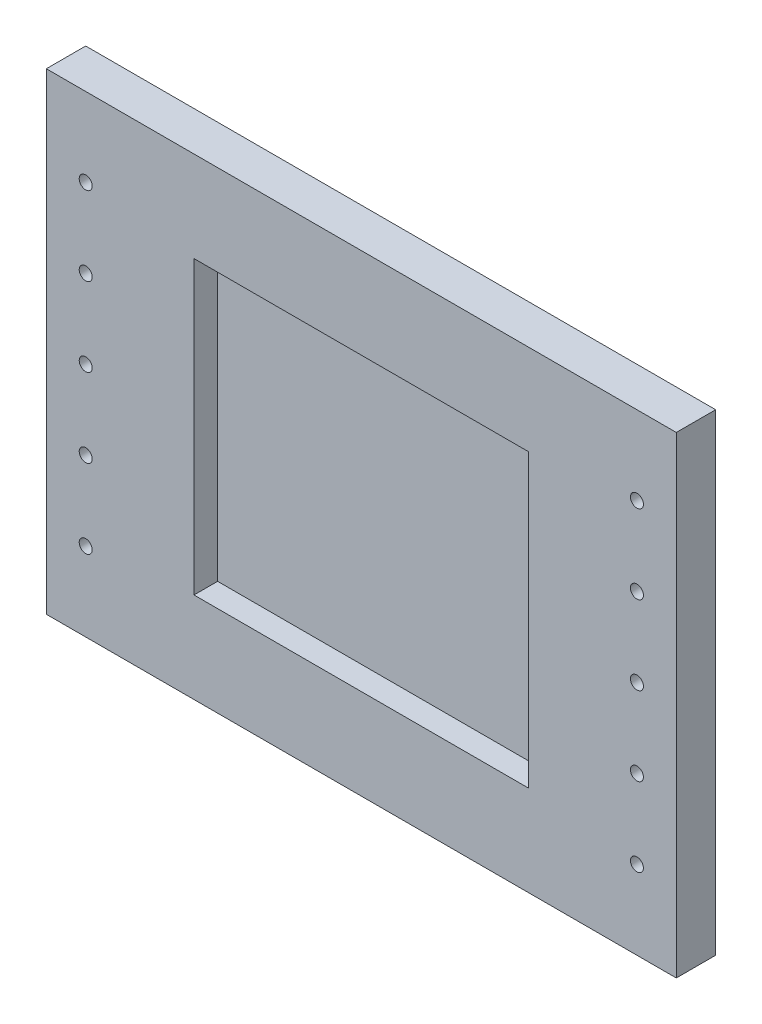
ISO-10303-21;
HEADER;
FILE_DESCRIPTION(('STEP AP214'),'2;1');
FILE_NAME('part.step','',(''),(''),'','','');
FILE_SCHEMA(('AUTOMOTIVE_DESIGN { 1 0 10303 214 1 1 1 1 }'));
ENDSEC;
DATA;
#1=APPLICATION_CONTEXT('core data for automotive mechanical design processes');
#2=APPLICATION_PROTOCOL_DEFINITION('international standard','automotive_design',2000,#1);
#3=PRODUCT_CONTEXT('',#1,'mechanical');
#4=PRODUCT('Part','Part','',(#3));
#5=PRODUCT_RELATED_PRODUCT_CATEGORY('part','',(#4));
#6=PRODUCT_DEFINITION_FORMATION('','',#4);
#7=PRODUCT_DEFINITION_CONTEXT('part definition',#1,'design');
#8=PRODUCT_DEFINITION('design','',#6,#7);
#9=PRODUCT_DEFINITION_SHAPE('','',#8);
#10=(LENGTH_UNIT() NAMED_UNIT(*) SI_UNIT(.MILLI.,.METRE.));
#11=(NAMED_UNIT(*) PLANE_ANGLE_UNIT() SI_UNIT($,.RADIAN.));
#12=(NAMED_UNIT(*) SI_UNIT($,.STERADIAN.) SOLID_ANGLE_UNIT());
#13=UNCERTAINTY_MEASURE_WITH_UNIT(LENGTH_MEASURE(1.E-05),#10,'distance_accuracy_value','');
#14=(GEOMETRIC_REPRESENTATION_CONTEXT(3) GLOBAL_UNCERTAINTY_ASSIGNED_CONTEXT((#13)) GLOBAL_UNIT_ASSIGNED_CONTEXT((#10,
#11,#12)) REPRESENTATION_CONTEXT('',''));
#15=CARTESIAN_POINT('',(0.,0.,0.));
#16=DIRECTION('',(0.,0.,1.));
#17=DIRECTION('',(1.,0.,0.));
#18=AXIS2_PLACEMENT_3D('',#15,#16,#17);
#19=CARTESIAN_POINT('',(80.,60.,10.));
#20=DIRECTION('',(-1.,0.,0.));
#21=DIRECTION('',(0.,0.,1.));
#22=AXIS2_PLACEMENT_3D('',#19,#20,#21);
#23=PLANE('',#22);
#24=DIRECTION('',(0.,1.,0.));
#25=VECTOR('',#24,1.);
#26=CARTESIAN_POINT('',(80.,60.,0.));
#27=LINE('',#26,#25);
#28=CARTESIAN_POINT('',(80.,-60.,0.));
#29=VERTEX_POINT('',#28);
#30=CARTESIAN_POINT('',(80.,60.,0.));
#31=VERTEX_POINT('',#30);
#32=EDGE_CURVE('E153',#29,#31,#27,.T.);
#33=ORIENTED_EDGE('',*,*,#32,.T.);
#34=DIRECTION('',(0.,0.,-1.));
#35=VECTOR('',#34,1.);
#36=CARTESIAN_POINT('',(80.,60.,10.));
#37=LINE('',#36,#35);
#38=CARTESIAN_POINT('',(80.,60.,10.));
#39=VERTEX_POINT('',#38);
#40=EDGE_CURVE('E11',#39,#31,#37,.T.);
#41=ORIENTED_EDGE('',*,*,#40,.F.);
#42=DIRECTION('',(0.,1.,0.));
#43=VECTOR('',#42,1.);
#44=CARTESIAN_POINT('',(80.,60.,10.));
#45=LINE('',#44,#43);
#46=CARTESIAN_POINT('',(80.,-60.,10.));
#47=VERTEX_POINT('',#46);
#48=EDGE_CURVE('E157',#47,#39,#45,.T.);
#49=ORIENTED_EDGE('',*,*,#48,.F.);
#50=DIRECTION('',(0.,0.,-1.));
#51=VECTOR('',#50,1.);
#52=CARTESIAN_POINT('',(80.,-60.,10.));
#53=LINE('',#52,#51);
#54=EDGE_CURVE('E163',#47,#29,#53,.T.);
#55=ORIENTED_EDGE('',*,*,#54,.T.);
#56=EDGE_LOOP('',(#33,#41,#49,#55));
#57=FACE_BOUND('',#56,.T.);
#58=ADVANCED_FACE('F41',(#57),#23,.F.);
#59=CARTESIAN_POINT('',(-80.,60.,10.));
#60=DIRECTION('',(0.,-1.,0.));
#61=DIRECTION('',(0.,0.,-1.));
#62=AXIS2_PLACEMENT_3D('',#59,#60,#61);
#63=PLANE('',#62);
#64=DIRECTION('',(-1.,0.,0.));
#65=VECTOR('',#64,1.);
#66=CARTESIAN_POINT('',(-80.,60.,0.));
#67=LINE('',#66,#65);
#68=CARTESIAN_POINT('',(-80.,60.,0.));
#69=VERTEX_POINT('',#68);
#70=EDGE_CURVE('E166',#31,#69,#67,.T.);
#71=ORIENTED_EDGE('',*,*,#70,.T.);
#72=DIRECTION('',(0.,0.,-1.));
#73=VECTOR('',#72,1.);
#74=CARTESIAN_POINT('',(-80.,60.,10.));
#75=LINE('',#74,#73);
#76=CARTESIAN_POINT('',(-80.,60.,10.));
#77=VERTEX_POINT('',#76);
#78=EDGE_CURVE('E48',#77,#69,#75,.T.);
#79=ORIENTED_EDGE('',*,*,#78,.F.);
#80=DIRECTION('',(-1.,0.,0.));
#81=VECTOR('',#80,1.);
#82=CARTESIAN_POINT('',(-80.,60.,10.));
#83=LINE('',#82,#81);
#84=EDGE_CURVE('E92',#39,#77,#83,.T.);
#85=ORIENTED_EDGE('',*,*,#84,.F.);
#86=ORIENTED_EDGE('',*,*,#40,.T.);
#87=EDGE_LOOP('',(#71,#79,#85,#86));
#88=FACE_BOUND('',#87,.T.);
#89=ADVANCED_FACE('F196',(#88),#63,.F.);
#90=CARTESIAN_POINT('',(-80.,60.,10.));
#91=DIRECTION('',(1.,0.,0.));
#92=DIRECTION('',(0.,1.,0.));
#93=AXIS2_PLACEMENT_3D('',#90,#91,#92);
#94=PLANE('',#93);
#95=DIRECTION('',(0.,-1.,0.));
#96=VECTOR('',#95,1.);
#97=CARTESIAN_POINT('',(-80.,60.,0.));
#98=LINE('',#97,#96);
#99=CARTESIAN_POINT('',(-80.,-60.,0.));
#100=VERTEX_POINT('',#99);
#101=EDGE_CURVE('E168',#69,#100,#98,.T.);
#102=ORIENTED_EDGE('',*,*,#101,.T.);
#103=DIRECTION('',(0.,0.,-1.));
#104=VECTOR('',#103,1.);
#105=CARTESIAN_POINT('',(-80.,-60.,10.));
#106=LINE('',#105,#104);
#107=CARTESIAN_POINT('',(-80.,-60.,10.));
#108=VERTEX_POINT('',#107);
#109=EDGE_CURVE('E172',#108,#100,#106,.T.);
#110=ORIENTED_EDGE('',*,*,#109,.F.);
#111=DIRECTION('',(0.,-1.,0.));
#112=VECTOR('',#111,1.);
#113=CARTESIAN_POINT('',(-80.,60.,10.));
#114=LINE('',#113,#112);
#115=EDGE_CURVE('E160',#77,#108,#114,.T.);
#116=ORIENTED_EDGE('',*,*,#115,.F.);
#117=ORIENTED_EDGE('',*,*,#78,.T.);
#118=EDGE_LOOP('',(#102,#110,#116,#117));
#119=FACE_BOUND('',#118,.T.);
#120=ADVANCED_FACE('F177',(#119),#94,.F.);
#121=CARTESIAN_POINT('',(-80.,-60.,10.));
#122=DIRECTION('',(0.,1.,0.));
#123=DIRECTION('',(0.,0.,1.));
#124=AXIS2_PLACEMENT_3D('',#121,#122,#123);
#125=PLANE('',#124);
#126=DIRECTION('',(1.,0.,0.));
#127=VECTOR('',#126,1.);
#128=CARTESIAN_POINT('',(-80.,-60.,0.));
#129=LINE('',#128,#127);
#130=EDGE_CURVE('E85',#100,#29,#129,.T.);
#131=ORIENTED_EDGE('',*,*,#130,.T.);
#132=ORIENTED_EDGE('',*,*,#54,.F.);
#133=DIRECTION('',(1.,0.,0.));
#134=VECTOR('',#133,1.);
#135=CARTESIAN_POINT('',(-80.,-60.,10.));
#136=LINE('',#135,#134);
#137=EDGE_CURVE('E64',#108,#47,#136,.T.);
#138=ORIENTED_EDGE('',*,*,#137,.F.);
#139=ORIENTED_EDGE('',*,*,#109,.T.);
#140=EDGE_LOOP('',(#131,#132,#138,#139));
#141=FACE_BOUND('',#140,.T.);
#142=ADVANCED_FACE('F185',(#141),#125,.F.);
#143=CARTESIAN_POINT('',(0.,0.,10.));
#144=DIRECTION('',(0.,0.,1.));
#145=DIRECTION('',(1.,0.,0.));
#146=AXIS2_PLACEMENT_3D('',#143,#144,#145);
#147=PLANE('',#146);
#148=CARTESIAN_POINT('',(-70.,40.,10.));
#149=DIRECTION('',(0.,0.,1.));
#150=DIRECTION('',(1.,0.,0.));
#151=AXIS2_PLACEMENT_3D('',#148,#149,#150);
#152=CIRCLE('',#151,1.65);
#153=CARTESIAN_POINT('',(-68.35,40.,10.));
#154=VERTEX_POINT('',#153);
#155=EDGE_CURVE('E378',#154,#154,#152,.T.);
#156=ORIENTED_EDGE('',*,*,#155,.F.);
#157=EDGE_LOOP('',(#156));
#158=FACE_BOUND('',#157,.T.);
#159=CARTESIAN_POINT('',(-70.,20.,10.));
#160=DIRECTION('',(0.,0.,1.));
#161=DIRECTION('',(1.,0.,0.));
#162=AXIS2_PLACEMENT_3D('',#159,#160,#161);
#163=CIRCLE('',#162,1.65);
#164=CARTESIAN_POINT('',(-68.35,20.,10.));
#165=VERTEX_POINT('',#164);
#166=EDGE_CURVE('E382',#165,#165,#163,.T.);
#167=ORIENTED_EDGE('',*,*,#166,.F.);
#168=EDGE_LOOP('',(#167));
#169=FACE_BOUND('',#168,.T.);
#170=CARTESIAN_POINT('',(-70.,0.,10.));
#171=DIRECTION('',(0.,0.,1.));
#172=DIRECTION('',(1.,0.,0.));
#173=AXIS2_PLACEMENT_3D('',#170,#171,#172);
#174=CIRCLE('',#173,1.65);
#175=CARTESIAN_POINT('',(-68.35,0.,10.));
#176=VERTEX_POINT('',#175);
#177=EDGE_CURVE('E391',#176,#176,#174,.T.);
#178=ORIENTED_EDGE('',*,*,#177,.F.);
#179=EDGE_LOOP('',(#178));
#180=FACE_BOUND('',#179,.T.);
#181=CARTESIAN_POINT('',(-70.,-20.,10.));
#182=DIRECTION('',(0.,0.,1.));
#183=DIRECTION('',(1.,0.,0.));
#184=AXIS2_PLACEMENT_3D('',#181,#182,#183);
#185=CIRCLE('',#184,1.65);
#186=CARTESIAN_POINT('',(-68.35,-20.,10.));
#187=VERTEX_POINT('',#186);
#188=EDGE_CURVE('E397',#187,#187,#185,.T.);
#189=ORIENTED_EDGE('',*,*,#188,.F.);
#190=EDGE_LOOP('',(#189));
#191=FACE_BOUND('',#190,.T.);
#192=CARTESIAN_POINT('',(-70.,-40.,10.));
#193=DIRECTION('',(0.,0.,1.));
#194=DIRECTION('',(1.,0.,0.));
#195=AXIS2_PLACEMENT_3D('',#192,#193,#194);
#196=CIRCLE('',#195,1.65);
#197=CARTESIAN_POINT('',(-68.35,-40.,10.));
#198=VERTEX_POINT('',#197);
#199=EDGE_CURVE('E403',#198,#198,#196,.T.);
#200=ORIENTED_EDGE('',*,*,#199,.F.);
#201=EDGE_LOOP('',(#200));
#202=FACE_BOUND('',#201,.T.);
#203=CARTESIAN_POINT('',(70.,40.,10.));
#204=DIRECTION('',(0.,0.,-1.));
#205=DIRECTION('',(-1.,0.,0.));
#206=AXIS2_PLACEMENT_3D('',#203,#204,#205);
#207=CIRCLE('',#206,1.65);
#208=CARTESIAN_POINT('',(68.35,40.,10.));
#209=VERTEX_POINT('',#208);
#210=EDGE_CURVE('E147',#209,#209,#207,.T.);
#211=ORIENTED_EDGE('',*,*,#210,.T.);
#212=EDGE_LOOP('',(#211));
#213=FACE_BOUND('',#212,.T.);
#214=CARTESIAN_POINT('',(70.,20.,10.));
#215=DIRECTION('',(0.,0.,-1.));
#216=DIRECTION('',(-1.,0.,0.));
#217=AXIS2_PLACEMENT_3D('',#214,#215,#216);
#218=CIRCLE('',#217,1.65);
#219=CARTESIAN_POINT('',(68.35,20.,10.));
#220=VERTEX_POINT('',#219);
#221=EDGE_CURVE('E417',#220,#220,#218,.T.);
#222=ORIENTED_EDGE('',*,*,#221,.T.);
#223=EDGE_LOOP('',(#222));
#224=FACE_BOUND('',#223,.T.);
#225=CARTESIAN_POINT('',(70.,0.,10.));
#226=DIRECTION('',(0.,0.,-1.));
#227=DIRECTION('',(-1.,0.,0.));
#228=AXIS2_PLACEMENT_3D('',#225,#226,#227);
#229=CIRCLE('',#228,1.65);
#230=CARTESIAN_POINT('',(68.35,0.,10.));
#231=VERTEX_POINT('',#230);
#232=EDGE_CURVE('E423',#231,#231,#229,.T.);
#233=ORIENTED_EDGE('',*,*,#232,.T.);
#234=EDGE_LOOP('',(#233));
#235=FACE_BOUND('',#234,.T.);
#236=CARTESIAN_POINT('',(70.,-20.,10.));
#237=DIRECTION('',(0.,0.,-1.));
#238=DIRECTION('',(-1.,0.,0.));
#239=AXIS2_PLACEMENT_3D('',#236,#237,#238);
#240=CIRCLE('',#239,1.65);
#241=CARTESIAN_POINT('',(68.35,-20.,10.));
#242=VERTEX_POINT('',#241);
#243=EDGE_CURVE('E429',#242,#242,#240,.T.);
#244=ORIENTED_EDGE('',*,*,#243,.T.);
#245=EDGE_LOOP('',(#244));
#246=FACE_BOUND('',#245,.T.);
#247=CARTESIAN_POINT('',(70.,-40.,10.));
#248=DIRECTION('',(0.,0.,-1.));
#249=DIRECTION('',(-1.,0.,0.));
#250=AXIS2_PLACEMENT_3D('',#247,#248,#249);
#251=CIRCLE('',#250,1.65);
#252=CARTESIAN_POINT('',(68.35,-40.,10.));
#253=VERTEX_POINT('',#252);
#254=EDGE_CURVE('E140',#253,#253,#251,.T.);
#255=ORIENTED_EDGE('',*,*,#254,.T.);
#256=EDGE_LOOP('',(#255));
#257=FACE_BOUND('',#256,.T.);
#258=DIRECTION('',(0.,1.,0.));
#259=VECTOR('',#258,1.);
#260=CARTESIAN_POINT('',(42.5,37.,10.));
#261=LINE('',#260,#259);
#262=CARTESIAN_POINT('',(42.5,-37.,10.));
#263=VERTEX_POINT('',#262);
#264=CARTESIAN_POINT('',(42.5,37.,10.));
#265=VERTEX_POINT('',#264);
#266=EDGE_CURVE('E55',#263,#265,#261,.T.);
#267=ORIENTED_EDGE('',*,*,#266,.F.);
#268=DIRECTION('',(1.,0.,0.));
#269=VECTOR('',#268,1.);
#270=CARTESIAN_POINT('',(-42.5,-37.,10.));
#271=LINE('',#270,#269);
#272=CARTESIAN_POINT('',(-42.5,-37.,10.));
#273=VERTEX_POINT('',#272);
#274=EDGE_CURVE('E134',#273,#263,#271,.T.);
#275=ORIENTED_EDGE('',*,*,#274,.F.);
#276=DIRECTION('',(0.,-1.,0.));
#277=VECTOR('',#276,1.);
#278=CARTESIAN_POINT('',(-42.5,37.,10.));
#279=LINE('',#278,#277);
#280=CARTESIAN_POINT('',(-42.5,37.,10.));
#281=VERTEX_POINT('',#280);
#282=EDGE_CURVE('E137',#281,#273,#279,.T.);
#283=ORIENTED_EDGE('',*,*,#282,.F.);
#284=DIRECTION('',(-1.,0.,0.));
#285=VECTOR('',#284,1.);
#286=CARTESIAN_POINT('',(-42.5,37.,10.));
#287=LINE('',#286,#285);
#288=EDGE_CURVE('E146',#265,#281,#287,.T.);
#289=ORIENTED_EDGE('',*,*,#288,.F.);
#290=EDGE_LOOP('',(#267,#275,#283,#289));
#291=FACE_BOUND('',#290,.T.);
#292=ORIENTED_EDGE('',*,*,#48,.T.);
#293=ORIENTED_EDGE('',*,*,#84,.T.);
#294=ORIENTED_EDGE('',*,*,#115,.T.);
#295=ORIENTED_EDGE('',*,*,#137,.T.);
#296=EDGE_LOOP('',(#292,#293,#294,#295));
#297=FACE_BOUND('',#296,.T.);
#298=ADVANCED_FACE('F187',(#158,#169,#180,#191,#202,#213,#224,#235,#246,#257,#291,#297),#147,.T.);
#299=CARTESIAN_POINT('',(0.,0.,0.));
#300=DIRECTION('',(0.,0.,1.));
#301=DIRECTION('',(1.,0.,0.));
#302=AXIS2_PLACEMENT_3D('',#299,#300,#301);
#303=PLANE('',#302);
#304=CARTESIAN_POINT('',(-70.,40.,0.));
#305=DIRECTION('',(0.,0.,1.));
#306=DIRECTION('',(1.,0.,0.));
#307=AXIS2_PLACEMENT_3D('',#304,#305,#306);
#308=CIRCLE('',#307,1.65);
#309=CARTESIAN_POINT('',(-68.35,40.,0.));
#310=VERTEX_POINT('',#309);
#311=EDGE_CURVE('E381',#310,#310,#308,.T.);
#312=ORIENTED_EDGE('',*,*,#311,.T.);
#313=EDGE_LOOP('',(#312));
#314=FACE_BOUND('',#313,.T.);
#315=CARTESIAN_POINT('',(-70.,20.,0.));
#316=DIRECTION('',(0.,0.,1.));
#317=DIRECTION('',(1.,0.,0.));
#318=AXIS2_PLACEMENT_3D('',#315,#316,#317);
#319=CIRCLE('',#318,1.65);
#320=CARTESIAN_POINT('',(-68.35,20.,0.));
#321=VERTEX_POINT('',#320);
#322=EDGE_CURVE('E386',#321,#321,#319,.T.);
#323=ORIENTED_EDGE('',*,*,#322,.T.);
#324=EDGE_LOOP('',(#323));
#325=FACE_BOUND('',#324,.T.);
#326=CARTESIAN_POINT('',(-70.,0.,0.));
#327=DIRECTION('',(0.,0.,1.));
#328=DIRECTION('',(1.,0.,0.));
#329=AXIS2_PLACEMENT_3D('',#326,#327,#328);
#330=CIRCLE('',#329,1.65);
#331=CARTESIAN_POINT('',(-68.35,0.,0.));
#332=VERTEX_POINT('',#331);
#333=EDGE_CURVE('E394',#332,#332,#330,.T.);
#334=ORIENTED_EDGE('',*,*,#333,.T.);
#335=EDGE_LOOP('',(#334));
#336=FACE_BOUND('',#335,.T.);
#337=CARTESIAN_POINT('',(-70.,-20.,0.));
#338=DIRECTION('',(0.,0.,1.));
#339=DIRECTION('',(1.,0.,0.));
#340=AXIS2_PLACEMENT_3D('',#337,#338,#339);
#341=CIRCLE('',#340,1.65);
#342=CARTESIAN_POINT('',(-68.35,-20.,0.));
#343=VERTEX_POINT('',#342);
#344=EDGE_CURVE('E400',#343,#343,#341,.T.);
#345=ORIENTED_EDGE('',*,*,#344,.T.);
#346=EDGE_LOOP('',(#345));
#347=FACE_BOUND('',#346,.T.);
#348=CARTESIAN_POINT('',(-70.,-40.,0.));
#349=DIRECTION('',(0.,0.,1.));
#350=DIRECTION('',(1.,0.,0.));
#351=AXIS2_PLACEMENT_3D('',#348,#349,#350);
#352=CIRCLE('',#351,1.65);
#353=CARTESIAN_POINT('',(-68.35,-40.,0.));
#354=VERTEX_POINT('',#353);
#355=EDGE_CURVE('E406',#354,#354,#352,.T.);
#356=ORIENTED_EDGE('',*,*,#355,.T.);
#357=EDGE_LOOP('',(#356));
#358=FACE_BOUND('',#357,.T.);
#359=CARTESIAN_POINT('',(70.,40.,0.));
#360=DIRECTION('',(0.,0.,-1.));
#361=DIRECTION('',(-1.,0.,0.));
#362=AXIS2_PLACEMENT_3D('',#359,#360,#361);
#363=CIRCLE('',#362,1.65);
#364=CARTESIAN_POINT('',(68.35,40.,0.));
#365=VERTEX_POINT('',#364);
#366=EDGE_CURVE('E411',#365,#365,#363,.T.);
#367=ORIENTED_EDGE('',*,*,#366,.F.);
#368=EDGE_LOOP('',(#367));
#369=FACE_BOUND('',#368,.T.);
#370=CARTESIAN_POINT('',(70.,20.,0.));
#371=DIRECTION('',(0.,0.,-1.));
#372=DIRECTION('',(-1.,0.,0.));
#373=AXIS2_PLACEMENT_3D('',#370,#371,#372);
#374=CIRCLE('',#373,1.65);
#375=CARTESIAN_POINT('',(68.35,20.,0.));
#376=VERTEX_POINT('',#375);
#377=EDGE_CURVE('E414',#376,#376,#374,.T.);
#378=ORIENTED_EDGE('',*,*,#377,.F.);
#379=EDGE_LOOP('',(#378));
#380=FACE_BOUND('',#379,.T.);
#381=CARTESIAN_POINT('',(70.,0.,0.));
#382=DIRECTION('',(0.,0.,-1.));
#383=DIRECTION('',(-1.,0.,0.));
#384=AXIS2_PLACEMENT_3D('',#381,#382,#383);
#385=CIRCLE('',#384,1.65);
#386=CARTESIAN_POINT('',(68.35,0.,0.));
#387=VERTEX_POINT('',#386);
#388=EDGE_CURVE('E420',#387,#387,#385,.T.);
#389=ORIENTED_EDGE('',*,*,#388,.F.);
#390=EDGE_LOOP('',(#389));
#391=FACE_BOUND('',#390,.T.);
#392=CARTESIAN_POINT('',(70.,-20.,0.));
#393=DIRECTION('',(0.,0.,-1.));
#394=DIRECTION('',(-1.,0.,0.));
#395=AXIS2_PLACEMENT_3D('',#392,#393,#394);
#396=CIRCLE('',#395,1.65);
#397=CARTESIAN_POINT('',(68.35,-20.,0.));
#398=VERTEX_POINT('',#397);
#399=EDGE_CURVE('E426',#398,#398,#396,.T.);
#400=ORIENTED_EDGE('',*,*,#399,.F.);
#401=EDGE_LOOP('',(#400));
#402=FACE_BOUND('',#401,.T.);
#403=CARTESIAN_POINT('',(70.,-40.,0.));
#404=DIRECTION('',(0.,0.,-1.));
#405=DIRECTION('',(-1.,0.,0.));
#406=AXIS2_PLACEMENT_3D('',#403,#404,#405);
#407=CIRCLE('',#406,1.65);
#408=CARTESIAN_POINT('',(68.35,-40.,0.));
#409=VERTEX_POINT('',#408);
#410=EDGE_CURVE('E431',#409,#409,#407,.T.);
#411=ORIENTED_EDGE('',*,*,#410,.F.);
#412=EDGE_LOOP('',(#411));
#413=FACE_BOUND('',#412,.T.);
#414=ORIENTED_EDGE('',*,*,#32,.F.);
#415=ORIENTED_EDGE('',*,*,#130,.F.);
#416=ORIENTED_EDGE('',*,*,#101,.F.);
#417=ORIENTED_EDGE('',*,*,#70,.F.);
#418=EDGE_LOOP('',(#414,#415,#416,#417));
#419=FACE_BOUND('',#418,.T.);
#420=ADVANCED_FACE('F181',(#314,#325,#336,#347,#358,#369,#380,#391,#402,#413,#419),#303,.F.);
#421=CARTESIAN_POINT('',(42.5,37.,4.));
#422=DIRECTION('',(1.,0.,0.));
#423=DIRECTION('',(0.,1.,0.));
#424=AXIS2_PLACEMENT_3D('',#421,#422,#423);
#425=PLANE('',#424);
#426=ORIENTED_EDGE('',*,*,#266,.T.);
#427=DIRECTION('',(0.,0.,1.));
#428=VECTOR('',#427,1.);
#429=CARTESIAN_POINT('',(42.5,37.,4.));
#430=LINE('',#429,#428);
#431=CARTESIAN_POINT('',(42.5,37.,4.));
#432=VERTEX_POINT('',#431);
#433=EDGE_CURVE('E112',#432,#265,#430,.T.);
#434=ORIENTED_EDGE('',*,*,#433,.F.);
#435=DIRECTION('',(0.,1.,0.));
#436=VECTOR('',#435,1.);
#437=CARTESIAN_POINT('',(42.5,37.,4.));
#438=LINE('',#437,#436);
#439=CARTESIAN_POINT('',(42.5,-37.,4.));
#440=VERTEX_POINT('',#439);
#441=EDGE_CURVE('E116',#440,#432,#438,.T.);
#442=ORIENTED_EDGE('',*,*,#441,.F.);
#443=DIRECTION('',(0.,0.,1.));
#444=VECTOR('',#443,1.);
#445=CARTESIAN_POINT('',(42.5,-37.,4.));
#446=LINE('',#445,#444);
#447=EDGE_CURVE('E151',#440,#263,#446,.T.);
#448=ORIENTED_EDGE('',*,*,#447,.T.);
#449=EDGE_LOOP('',(#426,#434,#442,#448));
#450=FACE_BOUND('',#449,.T.);
#451=ADVANCED_FACE('F114',(#450),#425,.F.);
#452=CARTESIAN_POINT('',(-42.5,-37.,4.));
#453=DIRECTION('',(0.,-1.,0.));
#454=DIRECTION('',(0.,0.,-1.));
#455=AXIS2_PLACEMENT_3D('',#452,#453,#454);
#456=PLANE('',#455);
#457=ORIENTED_EDGE('',*,*,#274,.T.);
#458=ORIENTED_EDGE('',*,*,#447,.F.);
#459=DIRECTION('',(1.,0.,0.));
#460=VECTOR('',#459,1.);
#461=CARTESIAN_POINT('',(-42.5,-37.,4.));
#462=LINE('',#461,#460);
#463=CARTESIAN_POINT('',(-42.5,-37.,4.));
#464=VERTEX_POINT('',#463);
#465=EDGE_CURVE('E122',#464,#440,#462,.T.);
#466=ORIENTED_EDGE('',*,*,#465,.F.);
#467=DIRECTION('',(0.,0.,1.));
#468=VECTOR('',#467,1.);
#469=CARTESIAN_POINT('',(-42.5,-37.,4.));
#470=LINE('',#469,#468);
#471=EDGE_CURVE('E154',#464,#273,#470,.T.);
#472=ORIENTED_EDGE('',*,*,#471,.T.);
#473=EDGE_LOOP('',(#457,#458,#466,#472));
#474=FACE_BOUND('',#473,.T.);
#475=ADVANCED_FACE('F239',(#474),#456,.F.);
#476=CARTESIAN_POINT('',(-42.5,37.,4.));
#477=DIRECTION('',(-1.,0.,0.));
#478=DIRECTION('',(0.,-1.,0.));
#479=AXIS2_PLACEMENT_3D('',#476,#477,#478);
#480=PLANE('',#479);
#481=ORIENTED_EDGE('',*,*,#282,.T.);
#482=ORIENTED_EDGE('',*,*,#471,.F.);
#483=DIRECTION('',(0.,-1.,0.));
#484=VECTOR('',#483,1.);
#485=CARTESIAN_POINT('',(-42.5,37.,4.));
#486=LINE('',#485,#484);
#487=CARTESIAN_POINT('',(-42.5,37.,4.));
#488=VERTEX_POINT('',#487);
#489=EDGE_CURVE('E130',#488,#464,#486,.T.);
#490=ORIENTED_EDGE('',*,*,#489,.F.);
#491=DIRECTION('',(0.,0.,1.));
#492=VECTOR('',#491,1.);
#493=CARTESIAN_POINT('',(-42.5,37.,4.));
#494=LINE('',#493,#492);
#495=EDGE_CURVE('E121',#488,#281,#494,.T.);
#496=ORIENTED_EDGE('',*,*,#495,.T.);
#497=EDGE_LOOP('',(#481,#482,#490,#496));
#498=FACE_BOUND('',#497,.T.);
#499=ADVANCED_FACE('F248',(#498),#480,.F.);
#500=CARTESIAN_POINT('',(-42.5,37.,4.));
#501=DIRECTION('',(0.,1.,0.));
#502=DIRECTION('',(0.,0.,1.));
#503=AXIS2_PLACEMENT_3D('',#500,#501,#502);
#504=PLANE('',#503);
#505=ORIENTED_EDGE('',*,*,#288,.T.);
#506=ORIENTED_EDGE('',*,*,#495,.F.);
#507=DIRECTION('',(-1.,0.,0.));
#508=VECTOR('',#507,1.);
#509=CARTESIAN_POINT('',(-42.5,37.,4.));
#510=LINE('',#509,#508);
#511=EDGE_CURVE('E125',#432,#488,#510,.T.);
#512=ORIENTED_EDGE('',*,*,#511,.F.);
#513=ORIENTED_EDGE('',*,*,#433,.T.);
#514=EDGE_LOOP('',(#505,#506,#512,#513));
#515=FACE_BOUND('',#514,.T.);
#516=ADVANCED_FACE('F126',(#515),#504,.F.);
#517=CARTESIAN_POINT('',(0.,0.,4.));
#518=DIRECTION('',(0.,0.,1.));
#519=DIRECTION('',(1.,0.,0.));
#520=AXIS2_PLACEMENT_3D('',#517,#518,#519);
#521=PLANE('',#520);
#522=ORIENTED_EDGE('',*,*,#441,.T.);
#523=ORIENTED_EDGE('',*,*,#511,.T.);
#524=ORIENTED_EDGE('',*,*,#489,.T.);
#525=ORIENTED_EDGE('',*,*,#465,.T.);
#526=EDGE_LOOP('',(#522,#523,#524,#525));
#527=FACE_BOUND('',#526,.T.);
#528=ADVANCED_FACE('F132',(#527),#521,.T.);
#529=CARTESIAN_POINT('',(70.,-40.,10.));
#530=DIRECTION('',(0.,0.,-1.));
#531=DIRECTION('',(-1.,0.,0.));
#532=AXIS2_PLACEMENT_3D('',#529,#530,#531);
#533=CYLINDRICAL_SURFACE('',#532,1.65);
#534=ORIENTED_EDGE('',*,*,#254,.F.);
#535=EDGE_LOOP('',(#534));
#536=FACE_BOUND('',#535,.T.);
#537=ORIENTED_EDGE('',*,*,#410,.T.);
#538=EDGE_LOOP('',(#537));
#539=FACE_BOUND('',#538,.T.);
#540=ADVANCED_FACE('F275',(#536,#539),#533,.F.);
#541=CARTESIAN_POINT('',(70.,-20.,10.));
#542=DIRECTION('',(0.,0.,-1.));
#543=DIRECTION('',(-1.,0.,0.));
#544=AXIS2_PLACEMENT_3D('',#541,#542,#543);
#545=CYLINDRICAL_SURFACE('',#544,1.65);
#546=ORIENTED_EDGE('',*,*,#243,.F.);
#547=EDGE_LOOP('',(#546));
#548=FACE_BOUND('',#547,.T.);
#549=ORIENTED_EDGE('',*,*,#399,.T.);
#550=EDGE_LOOP('',(#549));
#551=FACE_BOUND('',#550,.T.);
#552=ADVANCED_FACE('F284',(#548,#551),#545,.F.);
#553=CARTESIAN_POINT('',(70.,0.,10.));
#554=DIRECTION('',(0.,0.,-1.));
#555=DIRECTION('',(-1.,0.,0.));
#556=AXIS2_PLACEMENT_3D('',#553,#554,#555);
#557=CYLINDRICAL_SURFACE('',#556,1.65);
#558=ORIENTED_EDGE('',*,*,#232,.F.);
#559=EDGE_LOOP('',(#558));
#560=FACE_BOUND('',#559,.T.);
#561=ORIENTED_EDGE('',*,*,#388,.T.);
#562=EDGE_LOOP('',(#561));
#563=FACE_BOUND('',#562,.T.);
#564=ADVANCED_FACE('F294',(#560,#563),#557,.F.);
#565=CARTESIAN_POINT('',(70.,20.,10.));
#566=DIRECTION('',(0.,0.,-1.));
#567=DIRECTION('',(-1.,0.,0.));
#568=AXIS2_PLACEMENT_3D('',#565,#566,#567);
#569=CYLINDRICAL_SURFACE('',#568,1.65);
#570=ORIENTED_EDGE('',*,*,#221,.F.);
#571=EDGE_LOOP('',(#570));
#572=FACE_BOUND('',#571,.T.);
#573=ORIENTED_EDGE('',*,*,#377,.T.);
#574=EDGE_LOOP('',(#573));
#575=FACE_BOUND('',#574,.T.);
#576=ADVANCED_FACE('F304',(#572,#575),#569,.F.);
#577=CARTESIAN_POINT('',(70.,40.,10.));
#578=DIRECTION('',(0.,0.,-1.));
#579=DIRECTION('',(-1.,0.,0.));
#580=AXIS2_PLACEMENT_3D('',#577,#578,#579);
#581=CYLINDRICAL_SURFACE('',#580,1.65);
#582=ORIENTED_EDGE('',*,*,#210,.F.);
#583=EDGE_LOOP('',(#582));
#584=FACE_BOUND('',#583,.T.);
#585=ORIENTED_EDGE('',*,*,#366,.T.);
#586=EDGE_LOOP('',(#585));
#587=FACE_BOUND('',#586,.T.);
#588=ADVANCED_FACE('F314',(#584,#587),#581,.F.);
#589=CARTESIAN_POINT('',(-70.,-40.,10.));
#590=DIRECTION('',(0.,0.,-1.));
#591=DIRECTION('',(-1.,0.,0.));
#592=AXIS2_PLACEMENT_3D('',#589,#590,#591);
#593=CYLINDRICAL_SURFACE('',#592,1.65);
#594=ORIENTED_EDGE('',*,*,#199,.T.);
#595=EDGE_LOOP('',(#594));
#596=FACE_BOUND('',#595,.T.);
#597=ORIENTED_EDGE('',*,*,#355,.F.);
#598=EDGE_LOOP('',(#597));
#599=FACE_BOUND('',#598,.T.);
#600=ADVANCED_FACE('F323',(#596,#599),#593,.F.);
#601=CARTESIAN_POINT('',(-70.,-20.,10.));
#602=DIRECTION('',(0.,0.,-1.));
#603=DIRECTION('',(-1.,0.,0.));
#604=AXIS2_PLACEMENT_3D('',#601,#602,#603);
#605=CYLINDRICAL_SURFACE('',#604,1.65);
#606=ORIENTED_EDGE('',*,*,#188,.T.);
#607=EDGE_LOOP('',(#606));
#608=FACE_BOUND('',#607,.T.);
#609=ORIENTED_EDGE('',*,*,#344,.F.);
#610=EDGE_LOOP('',(#609));
#611=FACE_BOUND('',#610,.T.);
#612=ADVANCED_FACE('F332',(#608,#611),#605,.F.);
#613=CARTESIAN_POINT('',(-70.,0.,10.));
#614=DIRECTION('',(0.,0.,-1.));
#615=DIRECTION('',(-1.,0.,0.));
#616=AXIS2_PLACEMENT_3D('',#613,#614,#615);
#617=CYLINDRICAL_SURFACE('',#616,1.65);
#618=ORIENTED_EDGE('',*,*,#177,.T.);
#619=EDGE_LOOP('',(#618));
#620=FACE_BOUND('',#619,.T.);
#621=ORIENTED_EDGE('',*,*,#333,.F.);
#622=EDGE_LOOP('',(#621));
#623=FACE_BOUND('',#622,.T.);
#624=ADVANCED_FACE('F342',(#620,#623),#617,.F.);
#625=CARTESIAN_POINT('',(-70.,20.,10.));
#626=DIRECTION('',(0.,0.,-1.));
#627=DIRECTION('',(-1.,0.,0.));
#628=AXIS2_PLACEMENT_3D('',#625,#626,#627);
#629=CYLINDRICAL_SURFACE('',#628,1.65);
#630=ORIENTED_EDGE('',*,*,#166,.T.);
#631=EDGE_LOOP('',(#630));
#632=FACE_BOUND('',#631,.T.);
#633=ORIENTED_EDGE('',*,*,#322,.F.);
#634=EDGE_LOOP('',(#633));
#635=FACE_BOUND('',#634,.T.);
#636=ADVANCED_FACE('F352',(#632,#635),#629,.F.);
#637=CARTESIAN_POINT('',(-70.,40.,10.));
#638=DIRECTION('',(0.,0.,-1.));
#639=DIRECTION('',(-1.,0.,0.));
#640=AXIS2_PLACEMENT_3D('',#637,#638,#639);
#641=CYLINDRICAL_SURFACE('',#640,1.65);
#642=ORIENTED_EDGE('',*,*,#155,.T.);
#643=EDGE_LOOP('',(#642));
#644=FACE_BOUND('',#643,.T.);
#645=ORIENTED_EDGE('',*,*,#311,.F.);
#646=EDGE_LOOP('',(#645));
#647=FACE_BOUND('',#646,.T.);
#648=ADVANCED_FACE('F362',(#644,#647),#641,.F.);
#649=CLOSED_SHELL('',(#58,#89,#120,#142,#298,#420,#451,#475,#499,#516,#528,#540,#552,#564,#576,
#588,#600,#612,#624,#636,#648));
#650=MANIFOLD_SOLID_BREP('B2',#649);
#651=ADVANCED_BREP_SHAPE_REPRESENTATION('',(#18,#650),#14);
#652=SHAPE_DEFINITION_REPRESENTATION(#9,#651);
ENDSEC;
END-ISO-10303-21;
